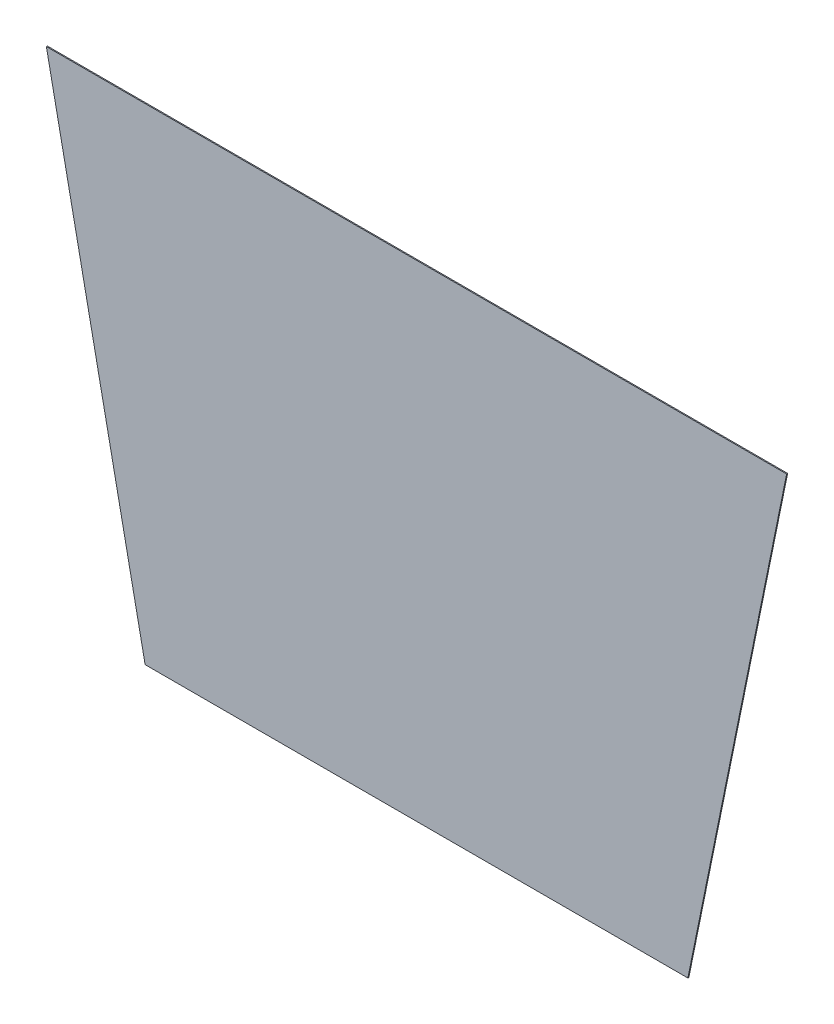
ISO-10303-21;
HEADER;
FILE_DESCRIPTION(('STEP AP214'),'2;1');
FILE_NAME('part.step','',(''),(''),'','','');
FILE_SCHEMA(('AUTOMOTIVE_DESIGN { 1 0 10303 214 1 1 1 1 }'));
ENDSEC;
DATA;
#1=APPLICATION_CONTEXT('core data for automotive mechanical design processes');
#2=APPLICATION_PROTOCOL_DEFINITION('international standard','automotive_design',2000,#1);
#3=PRODUCT_CONTEXT('',#1,'mechanical');
#4=PRODUCT('Part','Part','',(#3));
#5=PRODUCT_RELATED_PRODUCT_CATEGORY('part','',(#4));
#6=PRODUCT_DEFINITION_FORMATION('','',#4);
#7=PRODUCT_DEFINITION_CONTEXT('part definition',#1,'design');
#8=PRODUCT_DEFINITION('design','',#6,#7);
#9=PRODUCT_DEFINITION_SHAPE('','',#8);
#10=(LENGTH_UNIT() NAMED_UNIT(*) SI_UNIT(.MILLI.,.METRE.));
#11=(NAMED_UNIT(*) PLANE_ANGLE_UNIT() SI_UNIT($,.RADIAN.));
#12=(NAMED_UNIT(*) SI_UNIT($,.STERADIAN.) SOLID_ANGLE_UNIT());
#13=UNCERTAINTY_MEASURE_WITH_UNIT(LENGTH_MEASURE(1.E-05),#10,'distance_accuracy_value','');
#14=(GEOMETRIC_REPRESENTATION_CONTEXT(3) GLOBAL_UNCERTAINTY_ASSIGNED_CONTEXT((#13)) GLOBAL_UNIT_ASSIGNED_CONTEXT((#10,
#11,#12)) REPRESENTATION_CONTEXT('',''));
#15=CARTESIAN_POINT('',(0.,0.,0.));
#16=DIRECTION('',(0.,0.,1.));
#17=DIRECTION('',(1.,0.,0.));
#18=AXIS2_PLACEMENT_3D('',#15,#16,#17);
#19=CARTESIAN_POINT('',(-371.257484536082,-179.138226804124,1.5));
#20=DIRECTION('',(0.97995948596433,0.19919690225635,0.));
#21=DIRECTION('',(-0.19919690225635,0.97995948596433,0.));
#22=AXIS2_PLACEMENT_3D('',#19,#20,#21);
#23=PLANE('',#22);
#24=DIRECTION('',(0.19919690225635,-0.97995948596433,0.));
#25=VECTOR('',#24,1.);
#26=CARTESIAN_POINT('',(-371.257484536082,-179.138226804124,0.));
#27=LINE('',#26,#25);
#28=CARTESIAN_POINT('',(-518.663192205781,546.03179280948,0.));
#29=VERTEX_POINT('',#28);
#30=CARTESIAN_POINT('',(-371.257484536082,-179.138226804124,0.));
#31=VERTEX_POINT('',#30);
#32=EDGE_CURVE('E98',#29,#31,#27,.T.);
#33=ORIENTED_EDGE('',*,*,#32,.T.);
#34=DIRECTION('',(0.,0.,-1.));
#35=VECTOR('',#34,1.);
#36=CARTESIAN_POINT('',(-371.257484536082,-179.138226804124,1.5));
#37=LINE('',#36,#35);
#38=CARTESIAN_POINT('',(-371.257484536082,-179.138226804124,1.5));
#39=VERTEX_POINT('',#38);
#40=EDGE_CURVE('E11',#39,#31,#37,.T.);
#41=ORIENTED_EDGE('',*,*,#40,.F.);
#42=DIRECTION('',(0.19919690225635,-0.97995948596433,0.));
#43=VECTOR('',#42,1.);
#44=CARTESIAN_POINT('',(-371.257484536082,-179.138226804124,1.5));
#45=LINE('',#44,#43);
#46=CARTESIAN_POINT('',(-518.663192205781,546.03179280948,1.5));
#47=VERTEX_POINT('',#46);
#48=EDGE_CURVE('E86',#47,#39,#45,.T.);
#49=ORIENTED_EDGE('',*,*,#48,.F.);
#50=DIRECTION('',(0.,0.,-1.));
#51=VECTOR('',#50,1.);
#52=CARTESIAN_POINT('',(-518.663192205781,546.03179280948,1.5));
#53=LINE('',#52,#51);
#54=EDGE_CURVE('E94',#47,#29,#53,.T.);
#55=ORIENTED_EDGE('',*,*,#54,.T.);
#56=EDGE_LOOP('',(#33,#41,#49,#55));
#57=FACE_BOUND('',#56,.T.);
#58=ADVANCED_FACE('F35',(#57),#23,.F.);
#59=CARTESIAN_POINT('',(-371.257484536082,-179.138226804124,1.5));
#60=DIRECTION('',(0.,1.,0.));
#61=DIRECTION('',(0.,0.,1.));
#62=AXIS2_PLACEMENT_3D('',#59,#60,#61);
#63=PLANE('',#62);
#64=DIRECTION('',(1.,0.,0.));
#65=VECTOR('',#64,1.);
#66=CARTESIAN_POINT('',(-371.257484536082,-179.138226804124,0.));
#67=LINE('',#66,#65);
#68=CARTESIAN_POINT('',(438.742515463918,-179.138226804124,0.));
#69=VERTEX_POINT('',#68);
#70=EDGE_CURVE('E90',#31,#69,#67,.T.);
#71=ORIENTED_EDGE('',*,*,#70,.T.);
#72=DIRECTION('',(0.,0.,-1.));
#73=VECTOR('',#72,1.);
#74=CARTESIAN_POINT('',(438.742515463918,-179.138226804124,1.5));
#75=LINE('',#74,#73);
#76=CARTESIAN_POINT('',(438.742515463918,-179.138226804124,1.5));
#77=VERTEX_POINT('',#76);
#78=EDGE_CURVE('E43',#77,#69,#75,.T.);
#79=ORIENTED_EDGE('',*,*,#78,.F.);
#80=DIRECTION('',(1.,0.,0.));
#81=VECTOR('',#80,1.);
#82=CARTESIAN_POINT('',(-371.257484536082,-179.138226804124,1.5));
#83=LINE('',#82,#81);
#84=EDGE_CURVE('E81',#39,#77,#83,.T.);
#85=ORIENTED_EDGE('',*,*,#84,.F.);
#86=ORIENTED_EDGE('',*,*,#40,.T.);
#87=EDGE_LOOP('',(#71,#79,#85,#86));
#88=FACE_BOUND('',#87,.T.);
#89=ADVANCED_FACE('F89',(#88),#63,.F.);
#90=CARTESIAN_POINT('',(438.742515463918,-179.138226804124,1.5));
#91=DIRECTION('',(-0.979959485964331,0.199196902256343,0.));
#92=DIRECTION('',(-0.199196902256343,-0.979959485964332,0.));
#93=AXIS2_PLACEMENT_3D('',#90,#91,#92);
#94=PLANE('',#93);
#95=DIRECTION('',(0.199196902256343,0.979959485964332,0.));
#96=VECTOR('',#95,1.);
#97=CARTESIAN_POINT('',(438.742515463918,-179.138226804124,0.));
#98=LINE('',#97,#96);
#99=CARTESIAN_POINT('',(586.148223133611,546.031792809482,0.));
#100=VERTEX_POINT('',#99);
#101=EDGE_CURVE('E68',#69,#100,#98,.T.);
#102=ORIENTED_EDGE('',*,*,#101,.T.);
#103=DIRECTION('',(0.,0.,-1.));
#104=VECTOR('',#103,1.);
#105=CARTESIAN_POINT('',(586.148223133611,546.031792809482,1.5));
#106=LINE('',#105,#104);
#107=CARTESIAN_POINT('',(586.148223133611,546.031792809482,1.5));
#108=VERTEX_POINT('',#107);
#109=EDGE_CURVE('E91',#108,#100,#106,.T.);
#110=ORIENTED_EDGE('',*,*,#109,.F.);
#111=DIRECTION('',(0.199196902256343,0.979959485964332,0.));
#112=VECTOR('',#111,1.);
#113=CARTESIAN_POINT('',(438.742515463918,-179.138226804124,1.5));
#114=LINE('',#113,#112);
#115=EDGE_CURVE('E84',#77,#108,#114,.T.);
#116=ORIENTED_EDGE('',*,*,#115,.F.);
#117=ORIENTED_EDGE('',*,*,#78,.T.);
#118=EDGE_LOOP('',(#102,#110,#116,#117));
#119=FACE_BOUND('',#118,.T.);
#120=ADVANCED_FACE('F92',(#119),#94,.F.);
#121=CARTESIAN_POINT('',(586.148223133611,546.031792809482,1.5));
#122=DIRECTION('',(0.,-1.,0.));
#123=DIRECTION('',(1.,0.,0.));
#124=AXIS2_PLACEMENT_3D('',#121,#122,#123);
#125=PLANE('',#124);
#126=DIRECTION('',(-1.,0.,0.));
#127=VECTOR('',#126,1.);
#128=CARTESIAN_POINT('',(586.148223133611,546.031792809482,0.));
#129=LINE('',#128,#127);
#130=EDGE_CURVE('E74',#100,#29,#129,.T.);
#131=ORIENTED_EDGE('',*,*,#130,.T.);
#132=ORIENTED_EDGE('',*,*,#54,.F.);
#133=DIRECTION('',(-1.,0.,0.));
#134=VECTOR('',#133,1.);
#135=CARTESIAN_POINT('',(586.148223133611,546.031792809482,1.5));
#136=LINE('',#135,#134);
#137=EDGE_CURVE('E51',#108,#47,#136,.T.);
#138=ORIENTED_EDGE('',*,*,#137,.F.);
#139=ORIENTED_EDGE('',*,*,#109,.T.);
#140=EDGE_LOOP('',(#131,#132,#138,#139));
#141=FACE_BOUND('',#140,.T.);
#142=ADVANCED_FACE('F105',(#141),#125,.F.);
#143=CARTESIAN_POINT('',(0.,0.,1.5));
#144=DIRECTION('',(0.,0.,1.));
#145=DIRECTION('',(1.,0.,0.));
#146=AXIS2_PLACEMENT_3D('',#143,#144,#145);
#147=PLANE('',#146);
#148=ORIENTED_EDGE('',*,*,#48,.T.);
#149=ORIENTED_EDGE('',*,*,#84,.T.);
#150=ORIENTED_EDGE('',*,*,#115,.T.);
#151=ORIENTED_EDGE('',*,*,#137,.T.);
#152=EDGE_LOOP('',(#148,#149,#150,#151));
#153=FACE_BOUND('',#152,.T.);
#154=ADVANCED_FACE('F82',(#153),#147,.T.);
#155=CARTESIAN_POINT('',(0.,0.,0.));
#156=DIRECTION('',(0.,0.,1.));
#157=DIRECTION('',(1.,0.,0.));
#158=AXIS2_PLACEMENT_3D('',#155,#156,#157);
#159=PLANE('',#158);
#160=ORIENTED_EDGE('',*,*,#32,.F.);
#161=ORIENTED_EDGE('',*,*,#130,.F.);
#162=ORIENTED_EDGE('',*,*,#101,.F.);
#163=ORIENTED_EDGE('',*,*,#70,.F.);
#164=EDGE_LOOP('',(#160,#161,#162,#163));
#165=FACE_BOUND('',#164,.T.);
#166=ADVANCED_FACE('F108',(#165),#159,.F.);
#167=CLOSED_SHELL('',(#58,#89,#120,#142,#154,#166));
#168=MANIFOLD_SOLID_BREP('B2',#167);
#169=ADVANCED_BREP_SHAPE_REPRESENTATION('',(#18,#168),#14);
#170=SHAPE_DEFINITION_REPRESENTATION(#9,#169);
ENDSEC;
END-ISO-10303-21;
